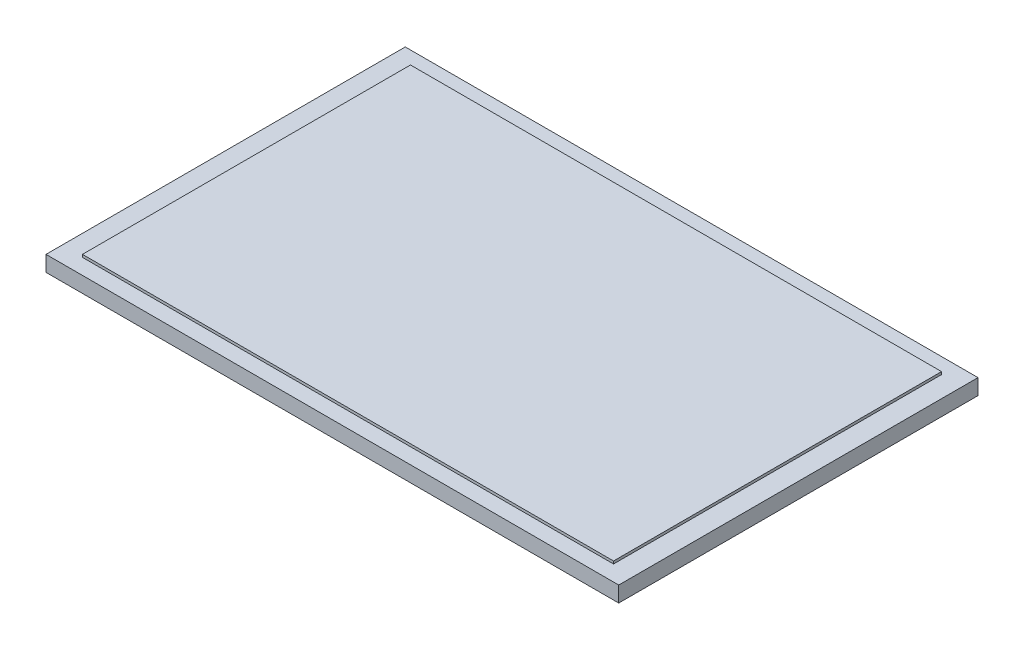
ISO-10303-21;
HEADER;
FILE_DESCRIPTION(('STEP AP214'),'2;1');
FILE_NAME('part.step','',(''),(''),'','','');
FILE_SCHEMA(('AUTOMOTIVE_DESIGN { 1 0 10303 214 1 1 1 1 }'));
ENDSEC;
DATA;
#1=APPLICATION_CONTEXT('core data for automotive mechanical design processes');
#2=APPLICATION_PROTOCOL_DEFINITION('international standard','automotive_design',2000,#1);
#3=PRODUCT_CONTEXT('',#1,'mechanical');
#4=PRODUCT('Part','Part','',(#3));
#5=PRODUCT_RELATED_PRODUCT_CATEGORY('part','',(#4));
#6=PRODUCT_DEFINITION_FORMATION('','',#4);
#7=PRODUCT_DEFINITION_CONTEXT('part definition',#1,'design');
#8=PRODUCT_DEFINITION('design','',#6,#7);
#9=PRODUCT_DEFINITION_SHAPE('','',#8);
#10=(LENGTH_UNIT() NAMED_UNIT(*) SI_UNIT(.MILLI.,.METRE.));
#11=(NAMED_UNIT(*) PLANE_ANGLE_UNIT() SI_UNIT($,.RADIAN.));
#12=(NAMED_UNIT(*) SI_UNIT($,.STERADIAN.) SOLID_ANGLE_UNIT());
#13=UNCERTAINTY_MEASURE_WITH_UNIT(LENGTH_MEASURE(1.E-05),#10,'distance_accuracy_value','');
#14=(GEOMETRIC_REPRESENTATION_CONTEXT(3) GLOBAL_UNCERTAINTY_ASSIGNED_CONTEXT((#13)) GLOBAL_UNIT_ASSIGNED_CONTEXT((#10,
#11,#12)) REPRESENTATION_CONTEXT('',''));
#15=CARTESIAN_POINT('',(0.,0.,0.));
#16=DIRECTION('',(0.,0.,1.));
#17=DIRECTION('',(1.,0.,0.));
#18=AXIS2_PLACEMENT_3D('',#15,#16,#17);
#19=CARTESIAN_POINT('',(0.,3.,0.));
#20=DIRECTION('',(0.,-1.,0.));
#21=DIRECTION('',(0.,0.,-1.));
#22=AXIS2_PLACEMENT_3D('',#19,#20,#21);
#23=PLANE('',#22);
#24=DIRECTION('',(0.,0.,-1.));
#25=VECTOR('',#24,1.);
#26=CARTESIAN_POINT('',(55.,3.,34.5));
#27=LINE('',#26,#25);
#28=CARTESIAN_POINT('',(55.,3.,34.5));
#29=VERTEX_POINT('',#28);
#30=CARTESIAN_POINT('',(55.,3.,-34.5));
#31=VERTEX_POINT('',#30);
#32=EDGE_CURVE('E145',#29,#31,#27,.T.);
#33=ORIENTED_EDGE('',*,*,#32,.T.);
#34=DIRECTION('',(-1.,0.,0.));
#35=VECTOR('',#34,1.);
#36=CARTESIAN_POINT('',(-55.,3.,-34.5));
#37=LINE('',#36,#35);
#38=CARTESIAN_POINT('',(-55.,3.,-34.5));
#39=VERTEX_POINT('',#38);
#40=EDGE_CURVE('E149',#31,#39,#37,.T.);
#41=ORIENTED_EDGE('',*,*,#40,.T.);
#42=DIRECTION('',(0.,0.,1.));
#43=VECTOR('',#42,1.);
#44=CARTESIAN_POINT('',(-55.,3.,34.5));
#45=LINE('',#44,#43);
#46=CARTESIAN_POINT('',(-55.,3.,34.5));
#47=VERTEX_POINT('',#46);
#48=EDGE_CURVE('E153',#39,#47,#45,.T.);
#49=ORIENTED_EDGE('',*,*,#48,.T.);
#50=DIRECTION('',(1.,0.,0.));
#51=VECTOR('',#50,1.);
#52=CARTESIAN_POINT('',(-55.,3.,34.5));
#53=LINE('',#52,#51);
#54=EDGE_CURVE('E156',#47,#29,#53,.T.);
#55=ORIENTED_EDGE('',*,*,#54,.T.);
#56=EDGE_LOOP('',(#33,#41,#49,#55));
#57=FACE_BOUND('',#56,.T.);
#58=DIRECTION('',(0.,0.,-1.));
#59=VECTOR('',#58,1.);
#60=CARTESIAN_POINT('',(51.,3.,31.5));
#61=LINE('',#60,#59);
#62=CARTESIAN_POINT('',(51.,3.,31.5));
#63=VERTEX_POINT('',#62);
#64=CARTESIAN_POINT('',(51.,3.,-31.5));
#65=VERTEX_POINT('',#64);
#66=EDGE_CURVE('E61',#63,#65,#61,.T.);
#67=ORIENTED_EDGE('',*,*,#66,.F.);
#68=DIRECTION('',(1.,0.,0.));
#69=VECTOR('',#68,1.);
#70=CARTESIAN_POINT('',(-51.,3.,31.5));
#71=LINE('',#70,#69);
#72=CARTESIAN_POINT('',(-51.,3.,31.5));
#73=VERTEX_POINT('',#72);
#74=EDGE_CURVE('E65',#73,#63,#71,.T.);
#75=ORIENTED_EDGE('',*,*,#74,.F.);
#76=DIRECTION('',(0.,0.,1.));
#77=VECTOR('',#76,1.);
#78=CARTESIAN_POINT('',(-51.,3.,31.5));
#79=LINE('',#78,#77);
#80=CARTESIAN_POINT('',(-51.,3.,-31.5));
#81=VERTEX_POINT('',#80);
#82=EDGE_CURVE('E313',#81,#73,#79,.T.);
#83=ORIENTED_EDGE('',*,*,#82,.F.);
#84=DIRECTION('',(-1.,0.,0.));
#85=VECTOR('',#84,1.);
#86=CARTESIAN_POINT('',(-51.,3.,-31.5));
#87=LINE('',#86,#85);
#88=EDGE_CURVE('E323',#65,#81,#87,.T.);
#89=ORIENTED_EDGE('',*,*,#88,.F.);
#90=EDGE_LOOP('',(#67,#75,#83,#89));
#91=FACE_BOUND('',#90,.T.);
#92=ADVANCED_FACE('F45',(#57,#91),#23,.F.);
#93=CARTESIAN_POINT('',(55.,3.,34.5));
#94=DIRECTION('',(-1.,0.,0.));
#95=DIRECTION('',(0.,0.,1.));
#96=AXIS2_PLACEMENT_3D('',#93,#94,#95);
#97=PLANE('',#96);
#98=DIRECTION('',(0.,0.,-1.));
#99=VECTOR('',#98,1.);
#100=CARTESIAN_POINT('',(55.,0.,34.5));
#101=LINE('',#100,#99);
#102=CARTESIAN_POINT('',(55.,0.,34.5));
#103=VERTEX_POINT('',#102);
#104=CARTESIAN_POINT('',(55.,0.,-34.5));
#105=VERTEX_POINT('',#104);
#106=EDGE_CURVE('E134',#103,#105,#101,.T.);
#107=ORIENTED_EDGE('',*,*,#106,.T.);
#108=DIRECTION('',(0.,-1.,0.));
#109=VECTOR('',#108,1.);
#110=CARTESIAN_POINT('',(55.,3.,-34.5));
#111=LINE('',#110,#109);
#112=EDGE_CURVE('E11',#31,#105,#111,.T.);
#113=ORIENTED_EDGE('',*,*,#112,.F.);
#114=ORIENTED_EDGE('',*,*,#32,.F.);
#115=DIRECTION('',(0.,-1.,0.));
#116=VECTOR('',#115,1.);
#117=CARTESIAN_POINT('',(55.,3.,34.5));
#118=LINE('',#117,#116);
#119=EDGE_CURVE('E158',#29,#103,#118,.T.);
#120=ORIENTED_EDGE('',*,*,#119,.T.);
#121=EDGE_LOOP('',(#107,#113,#114,#120));
#122=FACE_BOUND('',#121,.T.);
#123=ADVANCED_FACE('F47',(#122),#97,.F.);
#124=CARTESIAN_POINT('',(-55.,3.,-34.5));
#125=DIRECTION('',(0.,0.,1.));
#126=DIRECTION('',(1.,0.,0.));
#127=AXIS2_PLACEMENT_3D('',#124,#125,#126);
#128=PLANE('',#127);
#129=DIRECTION('',(-1.,0.,0.));
#130=VECTOR('',#129,1.);
#131=CARTESIAN_POINT('',(-55.,0.,-34.5));
#132=LINE('',#131,#130);
#133=CARTESIAN_POINT('',(-55.,0.,-34.5));
#134=VERTEX_POINT('',#133);
#135=EDGE_CURVE('E139',#105,#134,#132,.T.);
#136=ORIENTED_EDGE('',*,*,#135,.T.);
#137=DIRECTION('',(0.,-1.,0.));
#138=VECTOR('',#137,1.);
#139=CARTESIAN_POINT('',(-55.,3.,-34.5));
#140=LINE('',#139,#138);
#141=EDGE_CURVE('E54',#39,#134,#140,.T.);
#142=ORIENTED_EDGE('',*,*,#141,.F.);
#143=ORIENTED_EDGE('',*,*,#40,.F.);
#144=ORIENTED_EDGE('',*,*,#112,.T.);
#145=EDGE_LOOP('',(#136,#142,#143,#144));
#146=FACE_BOUND('',#145,.T.);
#147=ADVANCED_FACE('F194',(#146),#128,.F.);
#148=CARTESIAN_POINT('',(-55.,3.,34.5));
#149=DIRECTION('',(1.,0.,0.));
#150=DIRECTION('',(0.,0.,-1.));
#151=AXIS2_PLACEMENT_3D('',#148,#149,#150);
#152=PLANE('',#151);
#153=DIRECTION('',(0.,0.,1.));
#154=VECTOR('',#153,1.);
#155=CARTESIAN_POINT('',(-55.,0.,34.5));
#156=LINE('',#155,#154);
#157=CARTESIAN_POINT('',(-55.,0.,34.5));
#158=VERTEX_POINT('',#157);
#159=EDGE_CURVE('E162',#134,#158,#156,.T.);
#160=ORIENTED_EDGE('',*,*,#159,.T.);
#161=DIRECTION('',(0.,-1.,0.));
#162=VECTOR('',#161,1.);
#163=CARTESIAN_POINT('',(-55.,3.,34.5));
#164=LINE('',#163,#162);
#165=EDGE_CURVE('E170',#47,#158,#164,.T.);
#166=ORIENTED_EDGE('',*,*,#165,.F.);
#167=ORIENTED_EDGE('',*,*,#48,.F.);
#168=ORIENTED_EDGE('',*,*,#141,.T.);
#169=EDGE_LOOP('',(#160,#166,#167,#168));
#170=FACE_BOUND('',#169,.T.);
#171=ADVANCED_FACE('F179',(#170),#152,.F.);
#172=CARTESIAN_POINT('',(-55.,3.,34.5));
#173=DIRECTION('',(0.,0.,-1.));
#174=DIRECTION('',(-1.,0.,0.));
#175=AXIS2_PLACEMENT_3D('',#172,#173,#174);
#176=PLANE('',#175);
#177=DIRECTION('',(1.,0.,0.));
#178=VECTOR('',#177,1.);
#179=CARTESIAN_POINT('',(-55.,0.,34.5));
#180=LINE('',#179,#178);
#181=EDGE_CURVE('E150',#158,#103,#180,.T.);
#182=ORIENTED_EDGE('',*,*,#181,.T.);
#183=ORIENTED_EDGE('',*,*,#119,.F.);
#184=ORIENTED_EDGE('',*,*,#54,.F.);
#185=ORIENTED_EDGE('',*,*,#165,.T.);
#186=EDGE_LOOP('',(#182,#183,#184,#185));
#187=FACE_BOUND('',#186,.T.);
#188=ADVANCED_FACE('F188',(#187),#176,.F.);
#189=CARTESIAN_POINT('',(0.,0.,0.));
#190=DIRECTION('',(0.,-1.,0.));
#191=DIRECTION('',(0.,0.,-1.));
#192=AXIS2_PLACEMENT_3D('',#189,#190,#191);
#193=PLANE('',#192);
#194=ORIENTED_EDGE('',*,*,#106,.F.);
#195=ORIENTED_EDGE('',*,*,#181,.F.);
#196=ORIENTED_EDGE('',*,*,#159,.F.);
#197=ORIENTED_EDGE('',*,*,#135,.F.);
#198=EDGE_LOOP('',(#194,#195,#196,#197));
#199=FACE_BOUND('',#198,.T.);
#200=ADVANCED_FACE('F185',(#199),#193,.T.);
#201=CARTESIAN_POINT('',(51.,3.5,31.5));
#202=DIRECTION('',(-1.,0.,0.));
#203=DIRECTION('',(0.,0.,1.));
#204=AXIS2_PLACEMENT_3D('',#201,#202,#203);
#205=PLANE('',#204);
#206=ORIENTED_EDGE('',*,*,#66,.T.);
#207=DIRECTION('',(0.,-1.,0.));
#208=VECTOR('',#207,1.);
#209=CARTESIAN_POINT('',(51.,3.5,-31.5));
#210=LINE('',#209,#208);
#211=CARTESIAN_POINT('',(51.,3.5,-31.5));
#212=VERTEX_POINT('',#211);
#213=EDGE_CURVE('E114',#212,#65,#210,.T.);
#214=ORIENTED_EDGE('',*,*,#213,.F.);
#215=DIRECTION('',(0.,0.,-1.));
#216=VECTOR('',#215,1.);
#217=CARTESIAN_POINT('',(51.,3.5,31.5));
#218=LINE('',#217,#216);
#219=CARTESIAN_POINT('',(51.,3.5,31.5));
#220=VERTEX_POINT('',#219);
#221=EDGE_CURVE('E121',#220,#212,#218,.T.);
#222=ORIENTED_EDGE('',*,*,#221,.F.);
#223=DIRECTION('',(0.,-1.,0.));
#224=VECTOR('',#223,1.);
#225=CARTESIAN_POINT('',(51.,3.5,31.5));
#226=LINE('',#225,#224);
#227=EDGE_CURVE('E310',#220,#63,#226,.T.);
#228=ORIENTED_EDGE('',*,*,#227,.T.);
#229=EDGE_LOOP('',(#206,#214,#222,#228));
#230=FACE_BOUND('',#229,.T.);
#231=ADVANCED_FACE('F132',(#230),#205,.F.);
#232=CARTESIAN_POINT('',(-51.,3.5,-31.5));
#233=DIRECTION('',(0.,0.,1.));
#234=DIRECTION('',(1.,0.,0.));
#235=AXIS2_PLACEMENT_3D('',#232,#233,#234);
#236=PLANE('',#235);
#237=ORIENTED_EDGE('',*,*,#88,.T.);
#238=DIRECTION('',(0.,-1.,0.));
#239=VECTOR('',#238,1.);
#240=CARTESIAN_POINT('',(-51.,3.5,-31.5));
#241=LINE('',#240,#239);
#242=CARTESIAN_POINT('',(-51.,3.5,-31.5));
#243=VERTEX_POINT('',#242);
#244=EDGE_CURVE('E116',#243,#81,#241,.T.);
#245=ORIENTED_EDGE('',*,*,#244,.F.);
#246=DIRECTION('',(-1.,0.,0.));
#247=VECTOR('',#246,1.);
#248=CARTESIAN_POINT('',(-51.,3.5,-31.5));
#249=LINE('',#248,#247);
#250=EDGE_CURVE('E109',#212,#243,#249,.T.);
#251=ORIENTED_EDGE('',*,*,#250,.F.);
#252=ORIENTED_EDGE('',*,*,#213,.T.);
#253=EDGE_LOOP('',(#237,#245,#251,#252));
#254=FACE_BOUND('',#253,.T.);
#255=ADVANCED_FACE('F112',(#254),#236,.F.);
#256=CARTESIAN_POINT('',(-51.,3.5,31.5));
#257=DIRECTION('',(1.,0.,0.));
#258=DIRECTION('',(0.,0.,-1.));
#259=AXIS2_PLACEMENT_3D('',#256,#257,#258);
#260=PLANE('',#259);
#261=ORIENTED_EDGE('',*,*,#82,.T.);
#262=DIRECTION('',(0.,-1.,0.));
#263=VECTOR('',#262,1.);
#264=CARTESIAN_POINT('',(-51.,3.5,31.5));
#265=LINE('',#264,#263);
#266=CARTESIAN_POINT('',(-51.,3.5,31.5));
#267=VERTEX_POINT('',#266);
#268=EDGE_CURVE('E141',#267,#73,#265,.T.);
#269=ORIENTED_EDGE('',*,*,#268,.F.);
#270=DIRECTION('',(0.,0.,1.));
#271=VECTOR('',#270,1.);
#272=CARTESIAN_POINT('',(-51.,3.5,31.5));
#273=LINE('',#272,#271);
#274=EDGE_CURVE('E120',#243,#267,#273,.T.);
#275=ORIENTED_EDGE('',*,*,#274,.F.);
#276=ORIENTED_EDGE('',*,*,#244,.T.);
#277=EDGE_LOOP('',(#261,#269,#275,#276));
#278=FACE_BOUND('',#277,.T.);
#279=ADVANCED_FACE('F230',(#278),#260,.F.);
#280=CARTESIAN_POINT('',(-51.,3.5,31.5));
#281=DIRECTION('',(0.,0.,-1.));
#282=DIRECTION('',(-1.,0.,0.));
#283=AXIS2_PLACEMENT_3D('',#280,#281,#282);
#284=PLANE('',#283);
#285=ORIENTED_EDGE('',*,*,#74,.T.);
#286=ORIENTED_EDGE('',*,*,#227,.F.);
#287=DIRECTION('',(1.,0.,0.));
#288=VECTOR('',#287,1.);
#289=CARTESIAN_POINT('',(-51.,3.5,31.5));
#290=LINE('',#289,#288);
#291=EDGE_CURVE('E126',#267,#220,#290,.T.);
#292=ORIENTED_EDGE('',*,*,#291,.F.);
#293=ORIENTED_EDGE('',*,*,#268,.T.);
#294=EDGE_LOOP('',(#285,#286,#292,#293));
#295=FACE_BOUND('',#294,.T.);
#296=ADVANCED_FACE('F236',(#295),#284,.F.);
#297=CARTESIAN_POINT('',(0.,3.5,0.));
#298=DIRECTION('',(0.,-1.,0.));
#299=DIRECTION('',(0.,0.,-1.));
#300=AXIS2_PLACEMENT_3D('',#297,#298,#299);
#301=PLANE('',#300);
#302=ORIENTED_EDGE('',*,*,#221,.T.);
#303=ORIENTED_EDGE('',*,*,#250,.T.);
#304=ORIENTED_EDGE('',*,*,#274,.T.);
#305=ORIENTED_EDGE('',*,*,#291,.T.);
#306=EDGE_LOOP('',(#302,#303,#304,#305));
#307=FACE_BOUND('',#306,.T.);
#308=ADVANCED_FACE('F124',(#307),#301,.F.);
#309=CLOSED_SHELL('',(#92,#123,#147,#171,#188,#200,#231,#255,#279,#296,#308));
#310=MANIFOLD_SOLID_BREP('B2',#309);
#311=ADVANCED_BREP_SHAPE_REPRESENTATION('',(#18,#310),#14);
#312=SHAPE_DEFINITION_REPRESENTATION(#9,#311);
ENDSEC;
END-ISO-10303-21;
